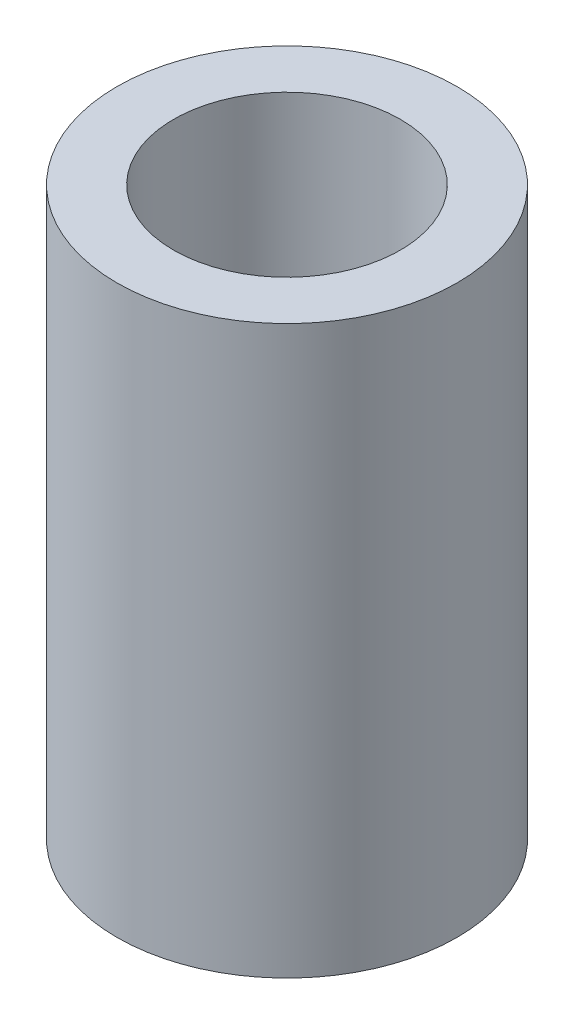
ISO-10303-21;
HEADER;
FILE_DESCRIPTION(('STEP AP214'),'2;1');
FILE_NAME('part.step','',(''),(''),'','','');
FILE_SCHEMA(('AUTOMOTIVE_DESIGN { 1 0 10303 214 1 1 1 1 }'));
ENDSEC;
DATA;
#1=APPLICATION_CONTEXT('core data for automotive mechanical design processes');
#2=APPLICATION_PROTOCOL_DEFINITION('international standard','automotive_design',2000,#1);
#3=PRODUCT_CONTEXT('',#1,'mechanical');
#4=PRODUCT('Part','Part','',(#3));
#5=PRODUCT_RELATED_PRODUCT_CATEGORY('part','',(#4));
#6=PRODUCT_DEFINITION_FORMATION('','',#4);
#7=PRODUCT_DEFINITION_CONTEXT('part definition',#1,'design');
#8=PRODUCT_DEFINITION('design','',#6,#7);
#9=PRODUCT_DEFINITION_SHAPE('','',#8);
#10=(LENGTH_UNIT() NAMED_UNIT(*) SI_UNIT(.MILLI.,.METRE.));
#11=(NAMED_UNIT(*) PLANE_ANGLE_UNIT() SI_UNIT($,.RADIAN.));
#12=(NAMED_UNIT(*) SI_UNIT($,.STERADIAN.) SOLID_ANGLE_UNIT());
#13=UNCERTAINTY_MEASURE_WITH_UNIT(LENGTH_MEASURE(1.E-05),#10,'distance_accuracy_value','');
#14=(GEOMETRIC_REPRESENTATION_CONTEXT(3) GLOBAL_UNCERTAINTY_ASSIGNED_CONTEXT((#13)) GLOBAL_UNIT_ASSIGNED_CONTEXT((#10,
#11,#12)) REPRESENTATION_CONTEXT('',''));
#15=CARTESIAN_POINT('',(0.,0.,0.));
#16=DIRECTION('',(0.,0.,1.));
#17=DIRECTION('',(1.,0.,0.));
#18=AXIS2_PLACEMENT_3D('',#15,#16,#17);
#19=CARTESIAN_POINT('',(0.,20.,0.));
#20=DIRECTION('',(0.,1.,0.));
#21=DIRECTION('',(0.,0.,1.));
#22=AXIS2_PLACEMENT_3D('',#19,#20,#21);
#23=PLANE('',#22);
#24=CARTESIAN_POINT('',(0.,20.,0.));
#25=DIRECTION('',(0.,1.,0.));
#26=DIRECTION('',(0.,0.,1.));
#27=AXIS2_PLACEMENT_3D('',#24,#25,#26);
#28=CIRCLE('',#27,6.);
#29=CARTESIAN_POINT('',(0.,20.,6.));
#30=VERTEX_POINT('',#29);
#31=EDGE_CURVE('E10',#30,#30,#28,.T.);
#32=ORIENTED_EDGE('',*,*,#31,.T.);
#33=EDGE_LOOP('',(#32));
#34=FACE_BOUND('',#33,.T.);
#35=CARTESIAN_POINT('',(0.,20.,0.));
#36=DIRECTION('',(0.,1.,0.));
#37=DIRECTION('',(0.,0.,1.));
#38=AXIS2_PLACEMENT_3D('',#35,#36,#37);
#39=CIRCLE('',#38,4.);
#40=CARTESIAN_POINT('',(0.,20.,4.));
#41=VERTEX_POINT('',#40);
#42=EDGE_CURVE('E50',#41,#41,#39,.T.);
#43=ORIENTED_EDGE('',*,*,#42,.F.);
#44=EDGE_LOOP('',(#43));
#45=FACE_BOUND('',#44,.T.);
#46=ADVANCED_FACE('F37',(#34,#45),#23,.T.);
#47=CARTESIAN_POINT('',(0.,0.,0.));
#48=DIRECTION('',(0.,1.,0.));
#49=DIRECTION('',(0.,0.,1.));
#50=AXIS2_PLACEMENT_3D('',#47,#48,#49);
#51=PLANE('',#50);
#52=CARTESIAN_POINT('',(0.,0.,0.));
#53=DIRECTION('',(0.,1.,0.));
#54=DIRECTION('',(0.,0.,1.));
#55=AXIS2_PLACEMENT_3D('',#52,#53,#54);
#56=CIRCLE('',#55,6.);
#57=CARTESIAN_POINT('',(0.,0.,6.));
#58=VERTEX_POINT('',#57);
#59=EDGE_CURVE('E41',#58,#58,#56,.T.);
#60=ORIENTED_EDGE('',*,*,#59,.F.);
#61=EDGE_LOOP('',(#60));
#62=FACE_BOUND('',#61,.T.);
#63=CARTESIAN_POINT('',(0.,0.,0.));
#64=DIRECTION('',(0.,1.,0.));
#65=DIRECTION('',(0.,0.,1.));
#66=AXIS2_PLACEMENT_3D('',#63,#64,#65);
#67=CIRCLE('',#66,4.);
#68=CARTESIAN_POINT('',(0.,0.,4.));
#69=VERTEX_POINT('',#68);
#70=EDGE_CURVE('E52',#69,#69,#67,.T.);
#71=ORIENTED_EDGE('',*,*,#70,.T.);
#72=EDGE_LOOP('',(#71));
#73=FACE_BOUND('',#72,.T.);
#74=ADVANCED_FACE('F64',(#62,#73),#51,.F.);
#75=CARTESIAN_POINT('',(0.,20.,0.));
#76=DIRECTION('',(0.,-1.,0.));
#77=DIRECTION('',(0.,0.,-1.));
#78=AXIS2_PLACEMENT_3D('',#75,#76,#77);
#79=CYLINDRICAL_SURFACE('',#78,6.);
#80=ORIENTED_EDGE('',*,*,#31,.F.);
#81=EDGE_LOOP('',(#80));
#82=FACE_BOUND('',#81,.T.);
#83=ORIENTED_EDGE('',*,*,#59,.T.);
#84=EDGE_LOOP('',(#83));
#85=FACE_BOUND('',#84,.T.);
#86=ADVANCED_FACE('F39',(#82,#85),#79,.T.);
#87=CARTESIAN_POINT('',(0.,20.,0.));
#88=DIRECTION('',(0.,-1.,0.));
#89=DIRECTION('',(0.,0.,-1.));
#90=AXIS2_PLACEMENT_3D('',#87,#88,#89);
#91=CYLINDRICAL_SURFACE('',#90,4.);
#92=ORIENTED_EDGE('',*,*,#42,.T.);
#93=EDGE_LOOP('',(#92));
#94=FACE_BOUND('',#93,.T.);
#95=ORIENTED_EDGE('',*,*,#70,.F.);
#96=EDGE_LOOP('',(#95));
#97=FACE_BOUND('',#96,.T.);
#98=ADVANCED_FACE('F60',(#94,#97),#91,.F.);
#99=CLOSED_SHELL('',(#46,#74,#86,#98));
#100=MANIFOLD_SOLID_BREP('B2',#99);
#101=ADVANCED_BREP_SHAPE_REPRESENTATION('',(#18,#100),#14);
#102=SHAPE_DEFINITION_REPRESENTATION(#9,#101);
ENDSEC;
END-ISO-10303-21;
